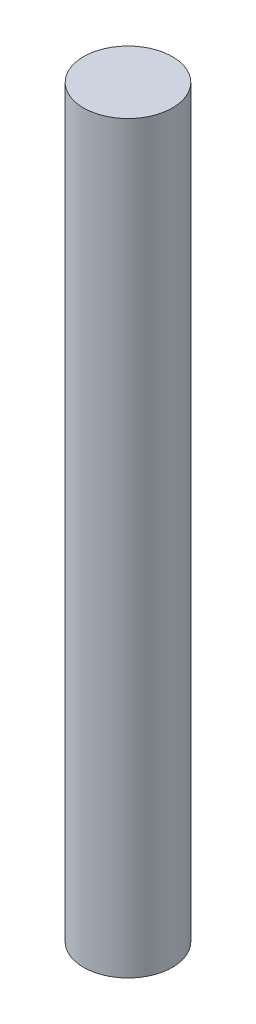
ISO-10303-21;
HEADER;
FILE_DESCRIPTION(('STEP AP214'),'2;1');
FILE_NAME('part.step','',(''),(''),'','','');
FILE_SCHEMA(('AUTOMOTIVE_DESIGN { 1 0 10303 214 1 1 1 1 }'));
ENDSEC;
DATA;
#1=APPLICATION_CONTEXT('core data for automotive mechanical design processes');
#2=APPLICATION_PROTOCOL_DEFINITION('international standard','automotive_design',2000,#1);
#3=PRODUCT_CONTEXT('',#1,'mechanical');
#4=PRODUCT('Part','Part','',(#3));
#5=PRODUCT_RELATED_PRODUCT_CATEGORY('part','',(#4));
#6=PRODUCT_DEFINITION_FORMATION('','',#4);
#7=PRODUCT_DEFINITION_CONTEXT('part definition',#1,'design');
#8=PRODUCT_DEFINITION('design','',#6,#7);
#9=PRODUCT_DEFINITION_SHAPE('','',#8);
#10=(LENGTH_UNIT() NAMED_UNIT(*) SI_UNIT(.MILLI.,.METRE.));
#11=(NAMED_UNIT(*) PLANE_ANGLE_UNIT() SI_UNIT($,.RADIAN.));
#12=(NAMED_UNIT(*) SI_UNIT($,.STERADIAN.) SOLID_ANGLE_UNIT());
#13=UNCERTAINTY_MEASURE_WITH_UNIT(LENGTH_MEASURE(1.E-05),#10,'distance_accuracy_value','');
#14=(GEOMETRIC_REPRESENTATION_CONTEXT(3) GLOBAL_UNCERTAINTY_ASSIGNED_CONTEXT((#13)) GLOBAL_UNIT_ASSIGNED_CONTEXT((#10,
#11,#12)) REPRESENTATION_CONTEXT('',''));
#15=CARTESIAN_POINT('',(0.,0.,0.));
#16=DIRECTION('',(0.,0.,1.));
#17=DIRECTION('',(1.,0.,0.));
#18=AXIS2_PLACEMENT_3D('',#15,#16,#17);
#19=CARTESIAN_POINT('',(0.,85.09,0.));
#20=DIRECTION('',(0.,-1.,0.));
#21=DIRECTION('',(0.,0.,-1.));
#22=AXIS2_PLACEMENT_3D('',#19,#20,#21);
#23=CYLINDRICAL_SURFACE('',#22,5.08);
#24=CARTESIAN_POINT('',(0.,85.09,0.));
#25=DIRECTION('',(0.,1.,0.));
#26=DIRECTION('',(0.,0.,1.));
#27=AXIS2_PLACEMENT_3D('',#24,#25,#26);
#28=CIRCLE('',#27,5.08);
#29=CARTESIAN_POINT('',(0.,85.09,5.08));
#30=VERTEX_POINT('',#29);
#31=EDGE_CURVE('E10',#30,#30,#28,.T.);
#32=ORIENTED_EDGE('',*,*,#31,.F.);
#33=EDGE_LOOP('',(#32));
#34=FACE_BOUND('',#33,.T.);
#35=CARTESIAN_POINT('',(0.,0.,0.));
#36=DIRECTION('',(0.,1.,0.));
#37=DIRECTION('',(0.,0.,1.));
#38=AXIS2_PLACEMENT_3D('',#35,#36,#37);
#39=CIRCLE('',#38,5.08);
#40=CARTESIAN_POINT('',(0.,0.,5.08));
#41=VERTEX_POINT('',#40);
#42=EDGE_CURVE('E34',#41,#41,#39,.T.);
#43=ORIENTED_EDGE('',*,*,#42,.T.);
#44=EDGE_LOOP('',(#43));
#45=FACE_BOUND('',#44,.T.);
#46=ADVANCED_FACE('F31',(#34,#45),#23,.T.);
#47=CARTESIAN_POINT('',(0.,85.09,0.));
#48=DIRECTION('',(0.,1.,0.));
#49=DIRECTION('',(0.,0.,1.));
#50=AXIS2_PLACEMENT_3D('',#47,#48,#49);
#51=PLANE('',#50);
#52=ORIENTED_EDGE('',*,*,#31,.T.);
#53=EDGE_LOOP('',(#52));
#54=FACE_BOUND('',#53,.T.);
#55=ADVANCED_FACE('F46',(#54),#51,.T.);
#56=CARTESIAN_POINT('',(0.,0.,0.));
#57=DIRECTION('',(0.,1.,0.));
#58=DIRECTION('',(0.,0.,1.));
#59=AXIS2_PLACEMENT_3D('',#56,#57,#58);
#60=PLANE('',#59);
#61=ORIENTED_EDGE('',*,*,#42,.F.);
#62=EDGE_LOOP('',(#61));
#63=FACE_BOUND('',#62,.T.);
#64=ADVANCED_FACE('F44',(#63),#60,.F.);
#65=CLOSED_SHELL('',(#46,#55,#64));
#66=MANIFOLD_SOLID_BREP('B2',#65);
#67=ADVANCED_BREP_SHAPE_REPRESENTATION('',(#18,#66),#14);
#68=SHAPE_DEFINITION_REPRESENTATION(#9,#67);
ENDSEC;
END-ISO-10303-21;
